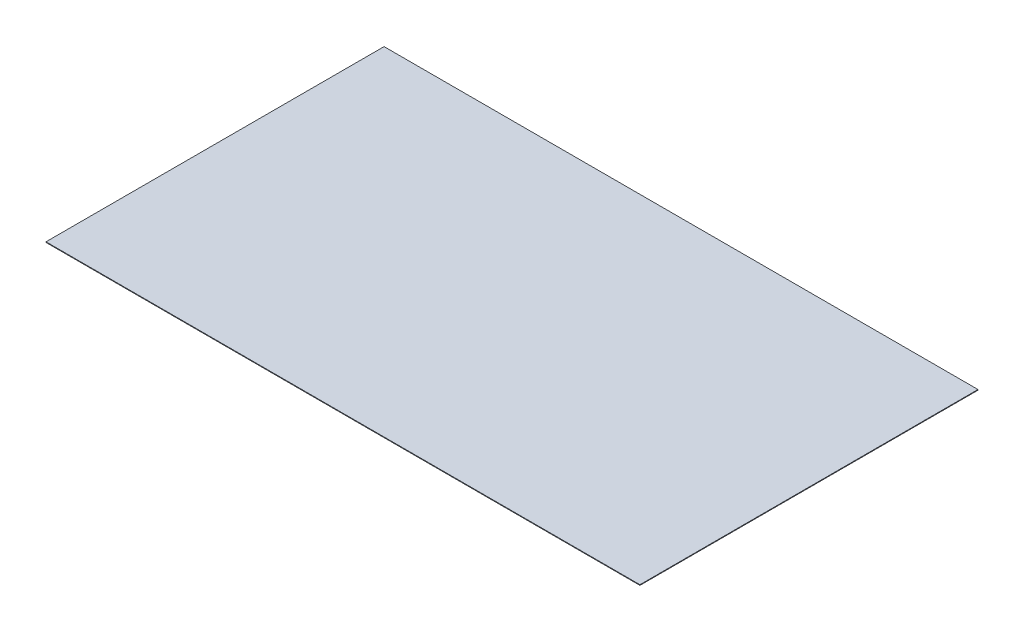
ISO-10303-21;
HEADER;
FILE_DESCRIPTION(('STEP AP214'),'2;1');
FILE_NAME('part.step','',(''),(''),'','','');
FILE_SCHEMA(('AUTOMOTIVE_DESIGN { 1 0 10303 214 1 1 1 1 }'));
ENDSEC;
DATA;
#1=APPLICATION_CONTEXT('core data for automotive mechanical design processes');
#2=APPLICATION_PROTOCOL_DEFINITION('international standard','automotive_design',2000,#1);
#3=PRODUCT_CONTEXT('',#1,'mechanical');
#4=PRODUCT('Part','Part','',(#3));
#5=PRODUCT_RELATED_PRODUCT_CATEGORY('part','',(#4));
#6=PRODUCT_DEFINITION_FORMATION('','',#4);
#7=PRODUCT_DEFINITION_CONTEXT('part definition',#1,'design');
#8=PRODUCT_DEFINITION('design','',#6,#7);
#9=PRODUCT_DEFINITION_SHAPE('','',#8);
#10=(LENGTH_UNIT() NAMED_UNIT(*) SI_UNIT(.MILLI.,.METRE.));
#11=(NAMED_UNIT(*) PLANE_ANGLE_UNIT() SI_UNIT($,.RADIAN.));
#12=(NAMED_UNIT(*) SI_UNIT($,.STERADIAN.) SOLID_ANGLE_UNIT());
#13=UNCERTAINTY_MEASURE_WITH_UNIT(LENGTH_MEASURE(1.E-05),#10,'distance_accuracy_value','');
#14=(GEOMETRIC_REPRESENTATION_CONTEXT(3) GLOBAL_UNCERTAINTY_ASSIGNED_CONTEXT((#13)) GLOBAL_UNIT_ASSIGNED_CONTEXT((#10,
#11,#12)) REPRESENTATION_CONTEXT('',''));
#15=CARTESIAN_POINT('',(0.,0.,0.));
#16=DIRECTION('',(0.,0.,1.));
#17=DIRECTION('',(1.,0.,0.));
#18=AXIS2_PLACEMENT_3D('',#15,#16,#17);
#19=CARTESIAN_POINT('',(-969.75,2.,552.));
#20=DIRECTION('',(1.,0.,0.));
#21=DIRECTION('',(0.,0.,-1.));
#22=AXIS2_PLACEMENT_3D('',#19,#20,#21);
#23=PLANE('',#22);
#24=DIRECTION('',(0.,0.,1.));
#25=VECTOR('',#24,1.);
#26=CARTESIAN_POINT('',(-969.75,0.,552.));
#27=LINE('',#26,#25);
#28=CARTESIAN_POINT('',(-969.75,0.,-552.));
#29=VERTEX_POINT('',#28);
#30=CARTESIAN_POINT('',(-969.75,0.,552.));
#31=VERTEX_POINT('',#30);
#32=EDGE_CURVE('E94',#29,#31,#27,.T.);
#33=ORIENTED_EDGE('',*,*,#32,.T.);
#34=DIRECTION('',(0.,-1.,0.));
#35=VECTOR('',#34,1.);
#36=CARTESIAN_POINT('',(-969.75,2.,552.));
#37=LINE('',#36,#35);
#38=CARTESIAN_POINT('',(-969.75,2.,552.));
#39=VERTEX_POINT('',#38);
#40=EDGE_CURVE('E11',#39,#31,#37,.T.);
#41=ORIENTED_EDGE('',*,*,#40,.F.);
#42=DIRECTION('',(0.,0.,1.));
#43=VECTOR('',#42,1.);
#44=CARTESIAN_POINT('',(-969.75,2.,552.));
#45=LINE('',#44,#43);
#46=CARTESIAN_POINT('',(-969.75,2.,-552.));
#47=VERTEX_POINT('',#46);
#48=EDGE_CURVE('E82',#47,#39,#45,.T.);
#49=ORIENTED_EDGE('',*,*,#48,.F.);
#50=DIRECTION('',(0.,-1.,0.));
#51=VECTOR('',#50,1.);
#52=CARTESIAN_POINT('',(-969.75,2.,-552.));
#53=LINE('',#52,#51);
#54=EDGE_CURVE('E90',#47,#29,#53,.T.);
#55=ORIENTED_EDGE('',*,*,#54,.T.);
#56=EDGE_LOOP('',(#33,#41,#49,#55));
#57=FACE_BOUND('',#56,.T.);
#58=ADVANCED_FACE('F31',(#57),#23,.F.);
#59=CARTESIAN_POINT('',(969.75,2.,552.));
#60=DIRECTION('',(0.,0.,-1.));
#61=DIRECTION('',(-1.,0.,0.));
#62=AXIS2_PLACEMENT_3D('',#59,#60,#61);
#63=PLANE('',#62);
#64=DIRECTION('',(1.,0.,0.));
#65=VECTOR('',#64,1.);
#66=CARTESIAN_POINT('',(969.75,0.,552.));
#67=LINE('',#66,#65);
#68=CARTESIAN_POINT('',(969.75,0.,552.));
#69=VERTEX_POINT('',#68);
#70=EDGE_CURVE('E86',#31,#69,#67,.T.);
#71=ORIENTED_EDGE('',*,*,#70,.T.);
#72=DIRECTION('',(0.,-1.,0.));
#73=VECTOR('',#72,1.);
#74=CARTESIAN_POINT('',(969.75,2.,552.));
#75=LINE('',#74,#73);
#76=CARTESIAN_POINT('',(969.75,2.,552.));
#77=VERTEX_POINT('',#76);
#78=EDGE_CURVE('E39',#77,#69,#75,.T.);
#79=ORIENTED_EDGE('',*,*,#78,.F.);
#80=DIRECTION('',(1.,0.,0.));
#81=VECTOR('',#80,1.);
#82=CARTESIAN_POINT('',(969.75,2.,552.));
#83=LINE('',#82,#81);
#84=EDGE_CURVE('E77',#39,#77,#83,.T.);
#85=ORIENTED_EDGE('',*,*,#84,.F.);
#86=ORIENTED_EDGE('',*,*,#40,.T.);
#87=EDGE_LOOP('',(#71,#79,#85,#86));
#88=FACE_BOUND('',#87,.T.);
#89=ADVANCED_FACE('F85',(#88),#63,.F.);
#90=CARTESIAN_POINT('',(969.75,2.,552.));
#91=DIRECTION('',(-1.,0.,0.));
#92=DIRECTION('',(0.,0.,1.));
#93=AXIS2_PLACEMENT_3D('',#90,#91,#92);
#94=PLANE('',#93);
#95=DIRECTION('',(0.,0.,-1.));
#96=VECTOR('',#95,1.);
#97=CARTESIAN_POINT('',(969.75,0.,552.));
#98=LINE('',#97,#96);
#99=CARTESIAN_POINT('',(969.75,0.,-552.));
#100=VERTEX_POINT('',#99);
#101=EDGE_CURVE('E64',#69,#100,#98,.T.);
#102=ORIENTED_EDGE('',*,*,#101,.T.);
#103=DIRECTION('',(0.,-1.,0.));
#104=VECTOR('',#103,1.);
#105=CARTESIAN_POINT('',(969.75,2.,-552.));
#106=LINE('',#105,#104);
#107=CARTESIAN_POINT('',(969.75,2.,-552.));
#108=VERTEX_POINT('',#107);
#109=EDGE_CURVE('E87',#108,#100,#106,.T.);
#110=ORIENTED_EDGE('',*,*,#109,.F.);
#111=DIRECTION('',(0.,0.,-1.));
#112=VECTOR('',#111,1.);
#113=CARTESIAN_POINT('',(969.75,2.,552.));
#114=LINE('',#113,#112);
#115=EDGE_CURVE('E80',#77,#108,#114,.T.);
#116=ORIENTED_EDGE('',*,*,#115,.F.);
#117=ORIENTED_EDGE('',*,*,#78,.T.);
#118=EDGE_LOOP('',(#102,#110,#116,#117));
#119=FACE_BOUND('',#118,.T.);
#120=ADVANCED_FACE('F88',(#119),#94,.F.);
#121=CARTESIAN_POINT('',(969.75,2.,-552.));
#122=DIRECTION('',(0.,0.,1.));
#123=DIRECTION('',(1.,0.,0.));
#124=AXIS2_PLACEMENT_3D('',#121,#122,#123);
#125=PLANE('',#124);
#126=DIRECTION('',(-1.,0.,0.));
#127=VECTOR('',#126,1.);
#128=CARTESIAN_POINT('',(969.75,0.,-552.));
#129=LINE('',#128,#127);
#130=EDGE_CURVE('E70',#100,#29,#129,.T.);
#131=ORIENTED_EDGE('',*,*,#130,.T.);
#132=ORIENTED_EDGE('',*,*,#54,.F.);
#133=DIRECTION('',(-1.,0.,0.));
#134=VECTOR('',#133,1.);
#135=CARTESIAN_POINT('',(969.75,2.,-552.));
#136=LINE('',#135,#134);
#137=EDGE_CURVE('E47',#108,#47,#136,.T.);
#138=ORIENTED_EDGE('',*,*,#137,.F.);
#139=ORIENTED_EDGE('',*,*,#109,.T.);
#140=EDGE_LOOP('',(#131,#132,#138,#139));
#141=FACE_BOUND('',#140,.T.);
#142=ADVANCED_FACE('F101',(#141),#125,.F.);
#143=CARTESIAN_POINT('',(-969.75,2.,-552.));
#144=DIRECTION('',(0.,1.,0.));
#145=DIRECTION('',(0.,0.,1.));
#146=AXIS2_PLACEMENT_3D('',#143,#144,#145);
#147=PLANE('',#146);
#148=ORIENTED_EDGE('',*,*,#48,.T.);
#149=ORIENTED_EDGE('',*,*,#84,.T.);
#150=ORIENTED_EDGE('',*,*,#115,.T.);
#151=ORIENTED_EDGE('',*,*,#137,.T.);
#152=EDGE_LOOP('',(#148,#149,#150,#151));
#153=FACE_BOUND('',#152,.T.);
#154=ADVANCED_FACE('F78',(#153),#147,.T.);
#155=CARTESIAN_POINT('',(-969.75,0.,-552.));
#156=DIRECTION('',(0.,1.,0.));
#157=DIRECTION('',(0.,0.,1.));
#158=AXIS2_PLACEMENT_3D('',#155,#156,#157);
#159=PLANE('',#158);
#160=ORIENTED_EDGE('',*,*,#32,.F.);
#161=ORIENTED_EDGE('',*,*,#130,.F.);
#162=ORIENTED_EDGE('',*,*,#101,.F.);
#163=ORIENTED_EDGE('',*,*,#70,.F.);
#164=EDGE_LOOP('',(#160,#161,#162,#163));
#165=FACE_BOUND('',#164,.T.);
#166=ADVANCED_FACE('F104',(#165),#159,.F.);
#167=CLOSED_SHELL('',(#58,#89,#120,#142,#154,#166));
#168=MANIFOLD_SOLID_BREP('B2',#167);
#169=ADVANCED_BREP_SHAPE_REPRESENTATION('',(#18,#168),#14);
#170=SHAPE_DEFINITION_REPRESENTATION(#9,#169);
ENDSEC;
END-ISO-10303-21;
